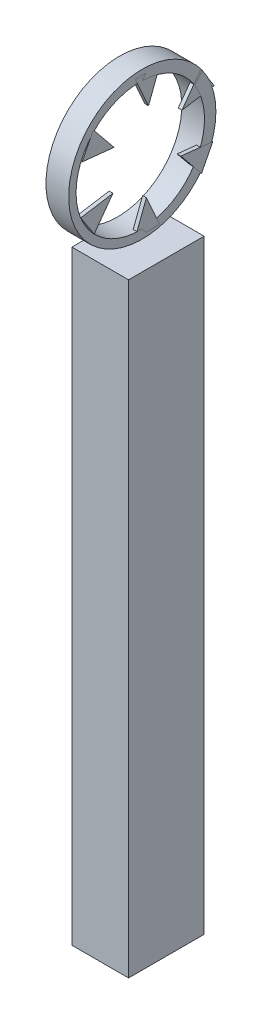
ISO-10303-21;
HEADER;
FILE_DESCRIPTION(('STEP AP214'),'2;1');
FILE_NAME('part.step','',(''),(''),'','','');
FILE_SCHEMA(('AUTOMOTIVE_DESIGN { 1 0 10303 214 1 1 1 1 }'));
ENDSEC;
DATA;
#1=APPLICATION_CONTEXT('core data for automotive mechanical design processes');
#2=APPLICATION_PROTOCOL_DEFINITION('international standard','automotive_design',2000,#1);
#3=PRODUCT_CONTEXT('',#1,'mechanical');
#4=PRODUCT('Part','Part','',(#3));
#5=PRODUCT_RELATED_PRODUCT_CATEGORY('part','',(#4));
#6=PRODUCT_DEFINITION_FORMATION('','',#4);
#7=PRODUCT_DEFINITION_CONTEXT('part definition',#1,'design');
#8=PRODUCT_DEFINITION('design','',#6,#7);
#9=PRODUCT_DEFINITION_SHAPE('','',#8);
#10=(LENGTH_UNIT() NAMED_UNIT(*) SI_UNIT(.MILLI.,.METRE.));
#11=(NAMED_UNIT(*) PLANE_ANGLE_UNIT() SI_UNIT($,.RADIAN.));
#12=(NAMED_UNIT(*) SI_UNIT($,.STERADIAN.) SOLID_ANGLE_UNIT());
#13=UNCERTAINTY_MEASURE_WITH_UNIT(LENGTH_MEASURE(1.E-05),#10,'distance_accuracy_value','');
#14=(GEOMETRIC_REPRESENTATION_CONTEXT(3) GLOBAL_UNCERTAINTY_ASSIGNED_CONTEXT((#13)) GLOBAL_UNIT_ASSIGNED_CONTEXT((#10,
#11,#12)) REPRESENTATION_CONTEXT('',''));
#15=CARTESIAN_POINT('',(0.,0.,0.));
#16=DIRECTION('',(0.,0.,1.));
#17=DIRECTION('',(1.,0.,0.));
#18=AXIS2_PLACEMENT_3D('',#15,#16,#17);
#19=CARTESIAN_POINT('',(8.255,32.5734694166654,31.4889569660101));
#20=DIRECTION('',(0.,-0.45432050294911,-0.890838302162669));
#21=DIRECTION('',(0.,0.89083830216267,-0.45432050294911));
#22=AXIS2_PLACEMENT_3D('',#19,#20,#21);
#23=PLANE('',#22);
#24=DIRECTION('',(0.,0.890838302162669,-0.45432050294911));
#25=VECTOR('',#24,1.);
#26=CARTESIAN_POINT('',(9.525,32.5734694166654,31.4889569660101));
#27=LINE('',#26,#25);
#28=CARTESIAN_POINT('',(9.525,32.5734694166654,31.4889569660101));
#29=VERTEX_POINT('',#28);
#30=CARTESIAN_POINT('',(9.525,39.9979876900178,27.7025112463823));
#31=VERTEX_POINT('',#30);
#32=EDGE_CURVE('E91',#29,#31,#27,.T.);
#33=ORIENTED_EDGE('',*,*,#32,.T.);
#34=DIRECTION('',(1.,0.,0.));
#35=VECTOR('',#34,1.);
#36=CARTESIAN_POINT('',(8.255,39.9979876900178,27.7025112463823));
#37=LINE('',#36,#35);
#38=CARTESIAN_POINT('',(8.255,39.9979876900178,27.7025112463823));
#39=VERTEX_POINT('',#38);
#40=EDGE_CURVE('E12',#39,#31,#37,.T.);
#41=ORIENTED_EDGE('',*,*,#40,.F.);
#42=DIRECTION('',(0.,0.890838302162669,-0.45432050294911));
#43=VECTOR('',#42,1.);
#44=CARTESIAN_POINT('',(8.255,32.5734694166654,31.4889569660101));
#45=LINE('',#44,#43);
#46=CARTESIAN_POINT('',(8.255,32.5734694166654,31.4889569660101));
#47=VERTEX_POINT('',#46);
#48=EDGE_CURVE('E84',#47,#39,#45,.T.);
#49=ORIENTED_EDGE('',*,*,#48,.F.);
#50=DIRECTION('',(1.,0.,0.));
#51=VECTOR('',#50,1.);
#52=CARTESIAN_POINT('',(8.255,32.5734694166654,31.4889569660101));
#53=LINE('',#52,#51);
#54=EDGE_CURVE('E92',#47,#29,#53,.T.);
#55=ORIENTED_EDGE('',*,*,#54,.T.);
#56=EDGE_LOOP('',(#33,#41,#49,#55));
#57=FACE_BOUND('',#56,.T.);
#58=ADVANCED_FACE('F44',(#57),#23,.F.);
#59=CARTESIAN_POINT('',(8.255,39.9979876900178,27.7025112463823));
#60=DIRECTION('',(0.,-0.630926660973929,0.775842476584189));
#61=DIRECTION('',(0.,-0.775842476584189,-0.630926660973929));
#62=AXIS2_PLACEMENT_3D('',#59,#60,#61);
#63=PLANE('',#62);
#64=DIRECTION('',(0.,-0.775842476584189,-0.630926660973929));
#65=VECTOR('',#64,1.);
#66=CARTESIAN_POINT('',(9.525,39.9979876900178,27.7025112463823));
#67=LINE('',#66,#65);
#68=CARTESIAN_POINT('',(9.525,31.4689193386133,20.7665457913043));
#69=VERTEX_POINT('',#68);
#70=EDGE_CURVE('E72',#31,#69,#67,.T.);
#71=ORIENTED_EDGE('',*,*,#70,.T.);
#72=DIRECTION('',(1.,0.,0.));
#73=VECTOR('',#72,1.);
#74=CARTESIAN_POINT('',(8.255,31.4689193386133,20.7665457913043));
#75=LINE('',#74,#73);
#76=CARTESIAN_POINT('',(8.255,31.4689193386133,20.7665457913043));
#77=VERTEX_POINT('',#76);
#78=EDGE_CURVE('E52',#77,#69,#75,.T.);
#79=ORIENTED_EDGE('',*,*,#78,.F.);
#80=DIRECTION('',(0.,-0.775842476584189,-0.630926660973929));
#81=VECTOR('',#80,1.);
#82=CARTESIAN_POINT('',(8.255,39.9979876900178,27.7025112463823));
#83=LINE('',#82,#81);
#84=EDGE_CURVE('E80',#39,#77,#83,.T.);
#85=ORIENTED_EDGE('',*,*,#84,.F.);
#86=ORIENTED_EDGE('',*,*,#40,.T.);
#87=EDGE_LOOP('',(#71,#79,#85,#86));
#88=FACE_BOUND('',#87,.T.);
#89=ADVANCED_FACE('F81',(#88),#63,.F.);
#90=CARTESIAN_POINT('',(8.255,31.4689193386133,20.7665457913043));
#91=DIRECTION('',(0.,0.994735996731296,-0.102470955919199));
#92=DIRECTION('',(0.,0.102470955919199,0.994735996731296));
#93=AXIS2_PLACEMENT_3D('',#90,#91,#92);
#94=PLANE('',#93);
#95=DIRECTION('',(0.,0.102470955919199,0.994735996731296));
#96=VECTOR('',#95,1.);
#97=CARTESIAN_POINT('',(9.525,31.4689193386133,20.7665457913043));
#98=LINE('',#97,#96);
#99=EDGE_CURVE('E77',#69,#29,#98,.T.);
#100=ORIENTED_EDGE('',*,*,#99,.T.);
#101=ORIENTED_EDGE('',*,*,#54,.F.);
#102=DIRECTION('',(0.,0.102470955919199,0.994735996731296));
#103=VECTOR('',#102,1.);
#104=CARTESIAN_POINT('',(8.255,31.4689193386133,20.7665457913043));
#105=LINE('',#104,#103);
#106=EDGE_CURVE('E60',#77,#47,#105,.T.);
#107=ORIENTED_EDGE('',*,*,#106,.F.);
#108=ORIENTED_EDGE('',*,*,#78,.T.);
#109=EDGE_LOOP('',(#100,#101,#107,#108));
#110=FACE_BOUND('',#109,.T.);
#111=ADVANCED_FACE('F99',(#110),#94,.F.);
#112=CARTESIAN_POINT('',(8.255,0.,0.));
#113=DIRECTION('',(1.,0.,0.));
#114=DIRECTION('',(0.,0.,-1.));
#115=AXIS2_PLACEMENT_3D('',#112,#113,#114);
#116=PLANE('',#115);
#117=ORIENTED_EDGE('',*,*,#48,.T.);
#118=ORIENTED_EDGE('',*,*,#84,.T.);
#119=ORIENTED_EDGE('',*,*,#106,.T.);
#120=EDGE_LOOP('',(#117,#118,#119));
#121=FACE_BOUND('',#120,.T.);
#122=ADVANCED_FACE('F87',(#121),#116,.F.);
#123=CARTESIAN_POINT('',(9.525,0.,0.));
#124=DIRECTION('',(1.,0.,0.));
#125=DIRECTION('',(0.,0.,-1.));
#126=AXIS2_PLACEMENT_3D('',#123,#124,#125);
#127=PLANE('',#126);
#128=ORIENTED_EDGE('',*,*,#32,.F.);
#129=ORIENTED_EDGE('',*,*,#99,.F.);
#130=ORIENTED_EDGE('',*,*,#70,.F.);
#131=EDGE_LOOP('',(#128,#129,#130));
#132=FACE_BOUND('',#131,.T.);
#133=ADVANCED_FACE('F100',(#132),#127,.T.);
#134=CLOSED_SHELL('',(#58,#89,#111,#122,#133));
#135=MANIFOLD_SOLID_BREP('B2',#134);
#136=CARTESIAN_POINT('',(8.255,47.5939942288502,13.5773551650429));
#137=DIRECTION('',(0.,-0.998648851811625,-0.0519660540672804));
#138=DIRECTION('',(0.,0.0519660540672804,-0.998648851811625));
#139=AXIS2_PLACEMENT_3D('',#136,#137,#138);
#140=PLANE('',#139);
#141=DIRECTION('',(0.,0.0519660540672804,-0.998648851811625));
#142=VECTOR('',#141,1.);
#143=CARTESIAN_POINT('',(9.525,47.5939942288502,13.5773551650429));
#144=LINE('',#143,#142);
#145=CARTESIAN_POINT('',(9.525,47.5939942288502,13.5773551650429));
#146=VERTEX_POINT('',#145);
#147=CARTESIAN_POINT('',(9.525,48.0270951822779,5.25431086964403));
#148=VERTEX_POINT('',#147);
#149=EDGE_CURVE('E199',#146,#148,#144,.T.);
#150=ORIENTED_EDGE('',*,*,#149,.T.);
#151=DIRECTION('',(1.,0.,0.));
#152=VECTOR('',#151,1.);
#153=CARTESIAN_POINT('',(8.255,48.0270951822779,5.25431086964403));
#154=LINE('',#153,#152);
#155=CARTESIAN_POINT('',(8.255,48.0270951822779,5.25431086964403));
#156=VERTEX_POINT('',#155);
#157=EDGE_CURVE('E42',#156,#148,#154,.T.);
#158=ORIENTED_EDGE('',*,*,#157,.F.);
#159=DIRECTION('',(0.,0.0519660540672804,-0.998648851811625));
#160=VECTOR('',#159,1.);
#161=CARTESIAN_POINT('',(8.255,47.5939942288502,13.5773551650429));
#162=LINE('',#161,#160);
#163=CARTESIAN_POINT('',(8.255,47.5939942288502,13.5773551650429));
#164=VERTEX_POINT('',#163);
#165=EDGE_CURVE('E192',#164,#156,#162,.T.);
#166=ORIENTED_EDGE('',*,*,#165,.F.);
#167=DIRECTION('',(1.,0.,0.));
#168=VECTOR('',#167,1.);
#169=CARTESIAN_POINT('',(8.255,47.5939942288502,13.5773551650429));
#170=LINE('',#169,#168);
#171=EDGE_CURVE('E200',#164,#146,#170,.T.);
#172=ORIENTED_EDGE('',*,*,#171,.T.);
#173=EDGE_LOOP('',(#150,#158,#166,#172));
#174=FACE_BOUND('',#173,.T.);
#175=ADVANCED_FACE('F152',(#174),#140,.F.);
#176=CARTESIAN_POINT('',(8.255,48.0270951822779,5.25431086964403));
#177=DIRECTION('',(0.,0.356435963569979,0.934319754620409));
#178=DIRECTION('',(0.,-0.934319754620409,0.356435963569979));
#179=AXIS2_PLACEMENT_3D('',#176,#177,#178);
#180=PLANE('',#179);
#181=DIRECTION('',(0.,-0.934319754620409,0.356435963569979));
#182=VECTOR('',#181,1.);
#183=CARTESIAN_POINT('',(9.525,48.0270951822779,5.25431086964403));
#184=LINE('',#183,#182);
#185=CARTESIAN_POINT('',(9.525,37.7558387227068,9.17271800503527));
#186=VERTEX_POINT('',#185);
#187=EDGE_CURVE('E180',#148,#186,#184,.T.);
#188=ORIENTED_EDGE('',*,*,#187,.T.);
#189=DIRECTION('',(1.,0.,0.));
#190=VECTOR('',#189,1.);
#191=CARTESIAN_POINT('',(8.255,37.7558387227068,9.17271800503527));
#192=LINE('',#191,#190);
#193=CARTESIAN_POINT('',(8.255,37.7558387227068,9.17271800503527));
#194=VERTEX_POINT('',#193);
#195=EDGE_CURVE('E160',#194,#186,#192,.T.);
#196=ORIENTED_EDGE('',*,*,#195,.F.);
#197=DIRECTION('',(0.,-0.934319754620409,0.356435963569979));
#198=VECTOR('',#197,1.);
#199=CARTESIAN_POINT('',(8.255,48.0270951822779,5.25431086964403));
#200=LINE('',#199,#198);
#201=EDGE_CURVE('E188',#156,#194,#200,.T.);
#202=ORIENTED_EDGE('',*,*,#201,.F.);
#203=ORIENTED_EDGE('',*,*,#157,.T.);
#204=EDGE_LOOP('',(#188,#196,#202,#203));
#205=FACE_BOUND('',#204,.T.);
#206=ADVANCED_FACE('F189',(#205),#180,.F.);
#207=CARTESIAN_POINT('',(8.255,37.7558387227068,9.17271800503527));
#208=DIRECTION('',(0.,0.408625547389544,-0.912702121187737));
#209=DIRECTION('',(0.,0.912702121187737,0.408625547389544));
#210=AXIS2_PLACEMENT_3D('',#207,#208,#209);
#211=PLANE('',#210);
#212=DIRECTION('',(0.,0.912702121187737,0.408625547389544));
#213=VECTOR('',#212,1.);
#214=CARTESIAN_POINT('',(9.525,37.7558387227068,9.17271800503527));
#215=LINE('',#214,#213);
#216=EDGE_CURVE('E185',#186,#146,#215,.T.);
#217=ORIENTED_EDGE('',*,*,#216,.T.);
#218=ORIENTED_EDGE('',*,*,#171,.F.);
#219=DIRECTION('',(0.,0.912702121187737,0.408625547389544));
#220=VECTOR('',#219,1.);
#221=CARTESIAN_POINT('',(8.255,37.7558387227068,9.17271800503527));
#222=LINE('',#221,#220);
#223=EDGE_CURVE('E168',#194,#164,#222,.T.);
#224=ORIENTED_EDGE('',*,*,#223,.F.);
#225=ORIENTED_EDGE('',*,*,#195,.T.);
#226=EDGE_LOOP('',(#217,#218,#224,#225));
#227=FACE_BOUND('',#226,.T.);
#228=ADVANCED_FACE('F207',(#227),#211,.F.);
#229=CARTESIAN_POINT('',(8.255,0.,0.));
#230=DIRECTION('',(1.,0.,0.));
#231=DIRECTION('',(0.,0.,-1.));
#232=AXIS2_PLACEMENT_3D('',#229,#230,#231);
#233=PLANE('',#232);
#234=ORIENTED_EDGE('',*,*,#165,.T.);
#235=ORIENTED_EDGE('',*,*,#201,.T.);
#236=ORIENTED_EDGE('',*,*,#223,.T.);
#237=EDGE_LOOP('',(#234,#235,#236));
#238=FACE_BOUND('',#237,.T.);
#239=ADVANCED_FACE('F195',(#238),#233,.F.);
#240=CARTESIAN_POINT('',(9.525,0.,0.));
#241=DIRECTION('',(1.,0.,0.));
#242=DIRECTION('',(0.,0.,-1.));
#243=AXIS2_PLACEMENT_3D('',#240,#241,#242);
#244=PLANE('',#243);
#245=ORIENTED_EDGE('',*,*,#149,.F.);
#246=ORIENTED_EDGE('',*,*,#216,.F.);
#247=ORIENTED_EDGE('',*,*,#187,.F.);
#248=EDGE_LOOP('',(#245,#246,#247));
#249=FACE_BOUND('',#248,.T.);
#250=ADVANCED_FACE('F208',(#249),#244,.T.);
#251=CLOSED_SHELL('',(#175,#206,#228,#239,#250));
#252=MANIFOLD_SOLID_BREP('B6',#251);
#253=CARTESIAN_POINT('',(8.255,39.592354452834,-8.38660180096717));
#254=DIRECTION('',(0.,-0.54432834886251,0.83887224809539));
#255=DIRECTION('',(0.,-0.83887224809539,-0.544328348862511));
#256=AXIS2_PLACEMENT_3D('',#253,#254,#255);
#257=PLANE('',#256);
#258=DIRECTION('',(0.,-0.83887224809539,-0.544328348862511));
#259=VECTOR('',#258,1.);
#260=CARTESIAN_POINT('',(9.525,39.592354452834,-8.38660180096717));
#261=LINE('',#260,#259);
#262=CARTESIAN_POINT('',(9.525,39.592354452834,-8.38660180096717));
#263=VERTEX_POINT('',#262);
#264=CARTESIAN_POINT('',(9.525,32.6009371329092,-12.9232003767382));
#265=VERTEX_POINT('',#264);
#266=EDGE_CURVE('E307',#263,#265,#261,.T.);
#267=ORIENTED_EDGE('',*,*,#266,.T.);
#268=DIRECTION('',(1.,0.,0.));
#269=VECTOR('',#268,1.);
#270=CARTESIAN_POINT('',(8.255,32.6009371329092,-12.9232003767382));
#271=LINE('',#270,#269);
#272=CARTESIAN_POINT('',(8.255,32.6009371329092,-12.9232003767382));
#273=VERTEX_POINT('',#272);
#274=EDGE_CURVE('E150',#273,#265,#271,.T.);
#275=ORIENTED_EDGE('',*,*,#274,.F.);
#276=DIRECTION('',(0.,-0.83887224809539,-0.544328348862511));
#277=VECTOR('',#276,1.);
#278=CARTESIAN_POINT('',(8.255,39.592354452834,-8.38660180096717));
#279=LINE('',#278,#277);
#280=CARTESIAN_POINT('',(8.255,39.592354452834,-8.38660180096717));
#281=VERTEX_POINT('',#280);
#282=EDGE_CURVE('E300',#281,#273,#279,.T.);
#283=ORIENTED_EDGE('',*,*,#282,.F.);
#284=DIRECTION('',(1.,0.,0.));
#285=VECTOR('',#284,1.);
#286=CARTESIAN_POINT('',(8.255,39.592354452834,-8.38660180096717));
#287=LINE('',#286,#285);
#288=EDGE_CURVE('E308',#281,#263,#287,.T.);
#289=ORIENTED_EDGE('',*,*,#288,.T.);
#290=EDGE_LOOP('',(#267,#275,#283,#289));
#291=FACE_BOUND('',#290,.T.);
#292=ADVANCED_FACE('F260',(#291),#257,.F.);
#293=CARTESIAN_POINT('',(8.255,32.6009371329092,-12.9232003767382));
#294=DIRECTION('',(0.,0.987362624543907,0.158477278036215));
#295=DIRECTION('',(0.,-0.158477278036215,0.987362624543907));
#296=AXIS2_PLACEMENT_3D('',#293,#294,#295);
#297=PLANE('',#296);
#298=DIRECTION('',(0.,-0.158477278036215,0.987362624543907));
#299=VECTOR('',#298,1.);
#300=CARTESIAN_POINT('',(9.525,32.6009371329092,-12.9232003767382));
#301=LINE('',#300,#299);
#302=CARTESIAN_POINT('',(9.525,30.8587490247427,-2.06882778626901));
#303=VERTEX_POINT('',#302);
#304=EDGE_CURVE('E288',#265,#303,#301,.T.);
#305=ORIENTED_EDGE('',*,*,#304,.T.);
#306=DIRECTION('',(1.,0.,0.));
#307=VECTOR('',#306,1.);
#308=CARTESIAN_POINT('',(8.255,30.8587490247427,-2.06882778626901));
#309=LINE('',#308,#307);
#310=CARTESIAN_POINT('',(8.255,30.8587490247427,-2.06882778626901));
#311=VERTEX_POINT('',#310);
#312=EDGE_CURVE('E268',#311,#303,#309,.T.);
#313=ORIENTED_EDGE('',*,*,#312,.F.);
#314=DIRECTION('',(0.,-0.158477278036215,0.987362624543907));
#315=VECTOR('',#314,1.);
#316=CARTESIAN_POINT('',(8.255,32.6009371329092,-12.9232003767382));
#317=LINE('',#316,#315);
#318=EDGE_CURVE('E296',#273,#311,#317,.T.);
#319=ORIENTED_EDGE('',*,*,#318,.F.);
#320=ORIENTED_EDGE('',*,*,#274,.T.);
#321=EDGE_LOOP('',(#305,#313,#319,#320));
#322=FACE_BOUND('',#321,.T.);
#323=ADVANCED_FACE('F297',(#322),#297,.F.);
#324=CARTESIAN_POINT('',(8.255,30.8587490247427,-2.06882778626901));
#325=DIRECTION('',(0.,-0.586110449341754,-0.810231165268535));
#326=DIRECTION('',(0.,0.810231165268535,-0.586110449341754));
#327=AXIS2_PLACEMENT_3D('',#324,#325,#326);
#328=PLANE('',#327);
#329=DIRECTION('',(0.,0.810231165268535,-0.586110449341754));
#330=VECTOR('',#329,1.);
#331=CARTESIAN_POINT('',(9.525,30.8587490247427,-2.06882778626901));
#332=LINE('',#331,#330);
#333=EDGE_CURVE('E293',#303,#263,#332,.T.);
#334=ORIENTED_EDGE('',*,*,#333,.T.);
#335=ORIENTED_EDGE('',*,*,#288,.F.);
#336=DIRECTION('',(0.,0.810231165268535,-0.586110449341754));
#337=VECTOR('',#336,1.);
#338=CARTESIAN_POINT('',(8.255,30.8587490247427,-2.06882778626901));
#339=LINE('',#338,#337);
#340=EDGE_CURVE('E276',#311,#281,#339,.T.);
#341=ORIENTED_EDGE('',*,*,#340,.F.);
#342=ORIENTED_EDGE('',*,*,#312,.T.);
#343=EDGE_LOOP('',(#334,#335,#341,#342));
#344=FACE_BOUND('',#343,.T.);
#345=ADVANCED_FACE('F315',(#344),#328,.F.);
#346=CARTESIAN_POINT('',(8.255,0.,0.));
#347=DIRECTION('',(1.,0.,0.));
#348=DIRECTION('',(0.,0.,-1.));
#349=AXIS2_PLACEMENT_3D('',#346,#347,#348);
#350=PLANE('',#349);
#351=ORIENTED_EDGE('',*,*,#282,.T.);
#352=ORIENTED_EDGE('',*,*,#318,.T.);
#353=ORIENTED_EDGE('',*,*,#340,.T.);
#354=EDGE_LOOP('',(#351,#352,#353));
#355=FACE_BOUND('',#354,.T.);
#356=ADVANCED_FACE('F303',(#355),#350,.F.);
#357=CARTESIAN_POINT('',(9.525,0.,0.));
#358=DIRECTION('',(1.,0.,0.));
#359=DIRECTION('',(0.,0.,-1.));
#360=AXIS2_PLACEMENT_3D('',#357,#358,#359);
#361=PLANE('',#360);
#362=ORIENTED_EDGE('',*,*,#266,.F.);
#363=ORIENTED_EDGE('',*,*,#333,.F.);
#364=ORIENTED_EDGE('',*,*,#304,.F.);
#365=EDGE_LOOP('',(#362,#363,#364));
#366=FACE_BOUND('',#365,.T.);
#367=ADVANCED_FACE('F316',(#366),#361,.T.);
#368=CLOSED_SHELL('',(#292,#323,#345,#356,#367));
#369=MANIFOLD_SOLID_BREP('B36',#368);
#370=CARTESIAN_POINT('',(8.255,16.5701898646329,-12.4389569660101));
#371=DIRECTION('',(0.,0.454320502949117,0.890838302162666));
#372=DIRECTION('',(0.,-0.890838302162666,0.454320502949117));
#373=AXIS2_PLACEMENT_3D('',#370,#371,#372);
#374=PLANE('',#373);
#375=DIRECTION('',(0.,-0.890838302162666,0.454320502949117));
#376=VECTOR('',#375,1.);
#377=CARTESIAN_POINT('',(9.525,16.5701898646329,-12.4389569660101));
#378=LINE('',#377,#376);
#379=CARTESIAN_POINT('',(9.525,16.5701898646329,-12.4389569660101));
#380=VERTEX_POINT('',#379);
#381=CARTESIAN_POINT('',(9.525,9.14567159128047,-8.6525112463822));
#382=VERTEX_POINT('',#381);
#383=EDGE_CURVE('E415',#380,#382,#378,.T.);
#384=ORIENTED_EDGE('',*,*,#383,.T.);
#385=DIRECTION('',(1.,0.,0.));
#386=VECTOR('',#385,1.);
#387=CARTESIAN_POINT('',(8.255,9.14567159128047,-8.6525112463822));
#388=LINE('',#387,#386);
#389=CARTESIAN_POINT('',(8.255,9.14567159128047,-8.6525112463822));
#390=VERTEX_POINT('',#389);
#391=EDGE_CURVE('E258',#390,#382,#388,.T.);
#392=ORIENTED_EDGE('',*,*,#391,.F.);
#393=DIRECTION('',(0.,-0.890838302162666,0.454320502949117));
#394=VECTOR('',#393,1.);
#395=CARTESIAN_POINT('',(8.255,16.5701898646329,-12.4389569660101));
#396=LINE('',#395,#394);
#397=CARTESIAN_POINT('',(8.255,16.5701898646329,-12.4389569660101));
#398=VERTEX_POINT('',#397);
#399=EDGE_CURVE('E408',#398,#390,#396,.T.);
#400=ORIENTED_EDGE('',*,*,#399,.F.);
#401=DIRECTION('',(1.,0.,0.));
#402=VECTOR('',#401,1.);
#403=CARTESIAN_POINT('',(8.255,16.5701898646329,-12.4389569660101));
#404=LINE('',#403,#402);
#405=EDGE_CURVE('E416',#398,#380,#404,.T.);
#406=ORIENTED_EDGE('',*,*,#405,.T.);
#407=EDGE_LOOP('',(#384,#392,#400,#406));
#408=FACE_BOUND('',#407,.T.);
#409=ADVANCED_FACE('F368',(#408),#374,.F.);
#410=CARTESIAN_POINT('',(8.255,9.14567159128047,-8.6525112463822));
#411=DIRECTION('',(0.,0.630926660973924,-0.775842476584194));
#412=DIRECTION('',(0.,0.775842476584194,0.630926660973924));
#413=AXIS2_PLACEMENT_3D('',#410,#411,#412);
#414=PLANE('',#413);
#415=DIRECTION('',(0.,0.775842476584194,0.630926660973924));
#416=VECTOR('',#415,1.);
#417=CARTESIAN_POINT('',(9.525,9.14567159128047,-8.6525112463822));
#418=LINE('',#417,#416);
#419=CARTESIAN_POINT('',(9.525,17.6747399426851,-1.71654579130426));
#420=VERTEX_POINT('',#419);
#421=EDGE_CURVE('E396',#382,#420,#418,.T.);
#422=ORIENTED_EDGE('',*,*,#421,.T.);
#423=DIRECTION('',(1.,0.,0.));
#424=VECTOR('',#423,1.);
#425=CARTESIAN_POINT('',(8.255,17.6747399426851,-1.71654579130426));
#426=LINE('',#425,#424);
#427=CARTESIAN_POINT('',(8.255,17.6747399426851,-1.71654579130426));
#428=VERTEX_POINT('',#427);
#429=EDGE_CURVE('E376',#428,#420,#426,.T.);
#430=ORIENTED_EDGE('',*,*,#429,.F.);
#431=DIRECTION('',(0.,0.775842476584194,0.630926660973924));
#432=VECTOR('',#431,1.);
#433=CARTESIAN_POINT('',(8.255,9.14567159128047,-8.6525112463822));
#434=LINE('',#433,#432);
#435=EDGE_CURVE('E404',#390,#428,#434,.T.);
#436=ORIENTED_EDGE('',*,*,#435,.F.);
#437=ORIENTED_EDGE('',*,*,#391,.T.);
#438=EDGE_LOOP('',(#422,#430,#436,#437));
#439=FACE_BOUND('',#438,.T.);
#440=ADVANCED_FACE('F405',(#439),#414,.F.);
#441=CARTESIAN_POINT('',(8.255,17.6747399426851,-1.71654579130426));
#442=DIRECTION('',(0.,-0.994735996731296,0.102470955919206));
#443=DIRECTION('',(0.,-0.102470955919206,-0.994735996731296));
#444=AXIS2_PLACEMENT_3D('',#441,#442,#443);
#445=PLANE('',#444);
#446=DIRECTION('',(0.,-0.102470955919206,-0.994735996731296));
#447=VECTOR('',#446,1.);
#448=CARTESIAN_POINT('',(9.525,17.6747399426851,-1.71654579130426));
#449=LINE('',#448,#447);
#450=EDGE_CURVE('E401',#420,#380,#449,.T.);
#451=ORIENTED_EDGE('',*,*,#450,.T.);
#452=ORIENTED_EDGE('',*,*,#405,.F.);
#453=DIRECTION('',(0.,-0.102470955919206,-0.994735996731296));
#454=VECTOR('',#453,1.);
#455=CARTESIAN_POINT('',(8.255,17.6747399426851,-1.71654579130426));
#456=LINE('',#455,#454);
#457=EDGE_CURVE('E384',#428,#398,#456,.T.);
#458=ORIENTED_EDGE('',*,*,#457,.F.);
#459=ORIENTED_EDGE('',*,*,#429,.T.);
#460=EDGE_LOOP('',(#451,#452,#458,#459));
#461=FACE_BOUND('',#460,.T.);
#462=ADVANCED_FACE('F423',(#461),#445,.F.);
#463=CARTESIAN_POINT('',(8.255,0.,0.));
#464=DIRECTION('',(1.,0.,0.));
#465=DIRECTION('',(0.,0.,-1.));
#466=AXIS2_PLACEMENT_3D('',#463,#464,#465);
#467=PLANE('',#466);
#468=ORIENTED_EDGE('',*,*,#399,.T.);
#469=ORIENTED_EDGE('',*,*,#435,.T.);
#470=ORIENTED_EDGE('',*,*,#457,.T.);
#471=EDGE_LOOP('',(#468,#469,#470));
#472=FACE_BOUND('',#471,.T.);
#473=ADVANCED_FACE('F411',(#472),#467,.F.);
#474=CARTESIAN_POINT('',(9.525,0.,0.));
#475=DIRECTION('',(1.,0.,0.));
#476=DIRECTION('',(0.,0.,-1.));
#477=AXIS2_PLACEMENT_3D('',#474,#475,#476);
#478=PLANE('',#477);
#479=ORIENTED_EDGE('',*,*,#383,.F.);
#480=ORIENTED_EDGE('',*,*,#450,.F.);
#481=ORIENTED_EDGE('',*,*,#421,.F.);
#482=EDGE_LOOP('',(#479,#480,#481));
#483=FACE_BOUND('',#482,.T.);
#484=ADVANCED_FACE('F424',(#483),#478,.T.);
#485=CLOSED_SHELL('',(#409,#440,#462,#473,#484));
#486=MANIFOLD_SOLID_BREP('B144',#485);
#487=CARTESIAN_POINT('',(8.255,1.54966505244817,5.4726448349572));
#488=DIRECTION('',(0.,0.998648851811625,0.0519660540672724));
#489=DIRECTION('',(0.,-0.0519660540672724,0.998648851811625));
#490=AXIS2_PLACEMENT_3D('',#487,#488,#489);
#491=PLANE('',#490);
#492=DIRECTION('',(0.,-0.0519660540672724,0.998648851811625));
#493=VECTOR('',#492,1.);
#494=CARTESIAN_POINT('',(9.525,1.54966505244817,5.4726448349572));
#495=LINE('',#494,#493);
#496=CARTESIAN_POINT('',(9.525,1.54966505244817,5.4726448349572));
#497=VERTEX_POINT('',#496);
#498=CARTESIAN_POINT('',(9.525,1.11656409902056,13.7956891303561));
#499=VERTEX_POINT('',#498);
#500=EDGE_CURVE('E523',#497,#499,#495,.T.);
#501=ORIENTED_EDGE('',*,*,#500,.T.);
#502=DIRECTION('',(1.,0.,0.));
#503=VECTOR('',#502,1.);
#504=CARTESIAN_POINT('',(8.255,1.11656409902056,13.7956891303561));
#505=LINE('',#504,#503);
#506=CARTESIAN_POINT('',(8.255,1.11656409902056,13.7956891303561));
#507=VERTEX_POINT('',#506);
#508=EDGE_CURVE('E366',#507,#499,#505,.T.);
#509=ORIENTED_EDGE('',*,*,#508,.F.);
#510=DIRECTION('',(0.,-0.0519660540672724,0.998648851811625));
#511=VECTOR('',#510,1.);
#512=CARTESIAN_POINT('',(8.255,1.54966505244817,5.4726448349572));
#513=LINE('',#512,#511);
#514=CARTESIAN_POINT('',(8.255,1.54966505244817,5.4726448349572));
#515=VERTEX_POINT('',#514);
#516=EDGE_CURVE('E516',#515,#507,#513,.T.);
#517=ORIENTED_EDGE('',*,*,#516,.F.);
#518=DIRECTION('',(1.,0.,0.));
#519=VECTOR('',#518,1.);
#520=CARTESIAN_POINT('',(8.255,1.54966505244817,5.4726448349572));
#521=LINE('',#520,#519);
#522=EDGE_CURVE('E524',#515,#497,#521,.T.);
#523=ORIENTED_EDGE('',*,*,#522,.T.);
#524=EDGE_LOOP('',(#501,#509,#517,#523));
#525=FACE_BOUND('',#524,.T.);
#526=ADVANCED_FACE('F476',(#525),#491,.F.);
#527=CARTESIAN_POINT('',(8.255,1.11656409902056,13.7956891303561));
#528=DIRECTION('',(0.,-0.356435963569986,-0.934319754620406));
#529=DIRECTION('',(0.,0.934319754620406,-0.356435963569986));
#530=AXIS2_PLACEMENT_3D('',#527,#528,#529);
#531=PLANE('',#530);
#532=DIRECTION('',(0.,0.934319754620406,-0.356435963569985));
#533=VECTOR('',#532,1.);
#534=CARTESIAN_POINT('',(9.525,1.11656409902056,13.7956891303561));
#535=LINE('',#534,#533);
#536=CARTESIAN_POINT('',(9.525,11.3878205585916,9.87728199496479));
#537=VERTEX_POINT('',#536);
#538=EDGE_CURVE('E504',#499,#537,#535,.T.);
#539=ORIENTED_EDGE('',*,*,#538,.T.);
#540=DIRECTION('',(1.,0.,0.));
#541=VECTOR('',#540,1.);
#542=CARTESIAN_POINT('',(8.255,11.3878205585916,9.87728199496479));
#543=LINE('',#542,#541);
#544=CARTESIAN_POINT('',(8.255,11.3878205585916,9.87728199496479));
#545=VERTEX_POINT('',#544);
#546=EDGE_CURVE('E484',#545,#537,#543,.T.);
#547=ORIENTED_EDGE('',*,*,#546,.F.);
#548=DIRECTION('',(0.,0.934319754620406,-0.356435963569985));
#549=VECTOR('',#548,1.);
#550=CARTESIAN_POINT('',(8.255,1.11656409902056,13.7956891303561));
#551=LINE('',#550,#549);
#552=EDGE_CURVE('E512',#507,#545,#551,.T.);
#553=ORIENTED_EDGE('',*,*,#552,.F.);
#554=ORIENTED_EDGE('',*,*,#508,.T.);
#555=EDGE_LOOP('',(#539,#547,#553,#554));
#556=FACE_BOUND('',#555,.T.);
#557=ADVANCED_FACE('F513',(#556),#531,.F.);
#558=CARTESIAN_POINT('',(8.255,11.3878205585916,9.87728199496479));
#559=DIRECTION('',(0.,-0.408625547389538,0.91270212118774));
#560=DIRECTION('',(0.,-0.91270212118774,-0.408625547389538));
#561=AXIS2_PLACEMENT_3D('',#558,#559,#560);
#562=PLANE('',#561);
#563=DIRECTION('',(0.,-0.91270212118774,-0.408625547389538));
#564=VECTOR('',#563,1.);
#565=CARTESIAN_POINT('',(9.525,11.3878205585916,9.87728199496479));
#566=LINE('',#565,#564);
#567=EDGE_CURVE('E509',#537,#497,#566,.T.);
#568=ORIENTED_EDGE('',*,*,#567,.T.);
#569=ORIENTED_EDGE('',*,*,#522,.F.);
#570=DIRECTION('',(0.,-0.91270212118774,-0.408625547389538));
#571=VECTOR('',#570,1.);
#572=CARTESIAN_POINT('',(8.255,11.3878205585916,9.87728199496479));
#573=LINE('',#572,#571);
#574=EDGE_CURVE('E492',#545,#515,#573,.T.);
#575=ORIENTED_EDGE('',*,*,#574,.F.);
#576=ORIENTED_EDGE('',*,*,#546,.T.);
#577=EDGE_LOOP('',(#568,#569,#575,#576));
#578=FACE_BOUND('',#577,.T.);
#579=ADVANCED_FACE('F531',(#578),#562,.F.);
#580=CARTESIAN_POINT('',(8.255,0.,0.));
#581=DIRECTION('',(1.,0.,0.));
#582=DIRECTION('',(0.,0.,-1.));
#583=AXIS2_PLACEMENT_3D('',#580,#581,#582);
#584=PLANE('',#583);
#585=ORIENTED_EDGE('',*,*,#516,.T.);
#586=ORIENTED_EDGE('',*,*,#552,.T.);
#587=ORIENTED_EDGE('',*,*,#574,.T.);
#588=EDGE_LOOP('',(#585,#586,#587));
#589=FACE_BOUND('',#588,.T.);
#590=ADVANCED_FACE('F519',(#589),#584,.F.);
#591=CARTESIAN_POINT('',(9.525,0.,0.));
#592=DIRECTION('',(1.,0.,0.));
#593=DIRECTION('',(0.,0.,-1.));
#594=AXIS2_PLACEMENT_3D('',#591,#592,#593);
#595=PLANE('',#594);
#596=ORIENTED_EDGE('',*,*,#500,.F.);
#597=ORIENTED_EDGE('',*,*,#567,.F.);
#598=ORIENTED_EDGE('',*,*,#538,.F.);
#599=EDGE_LOOP('',(#596,#597,#598));
#600=FACE_BOUND('',#599,.T.);
#601=ADVANCED_FACE('F532',(#600),#595,.T.);
#602=CLOSED_SHELL('',(#526,#557,#579,#590,#601));
#603=MANIFOLD_SOLID_BREP('B252',#602);
#604=CARTESIAN_POINT('',(8.255,9.5513048284646,27.4366018009673));
#605=DIRECTION('',(0.,0.544328348862504,-0.838872248095394));
#606=DIRECTION('',(0.,0.838872248095394,0.544328348862504));
#607=AXIS2_PLACEMENT_3D('',#604,#605,#606);
#608=PLANE('',#607);
#609=DIRECTION('',(0.,0.838872248095394,0.544328348862505));
#610=VECTOR('',#609,1.);
#611=CARTESIAN_POINT('',(9.525,9.5513048284646,27.4366018009673));
#612=LINE('',#611,#610);
#613=CARTESIAN_POINT('',(9.525,9.5513048284646,27.4366018009673));
#614=VERTEX_POINT('',#613);
#615=CARTESIAN_POINT('',(9.525,16.5427221483894,31.9732003767383));
#616=VERTEX_POINT('',#615);
#617=EDGE_CURVE('E629',#614,#616,#612,.T.);
#618=ORIENTED_EDGE('',*,*,#617,.T.);
#619=DIRECTION('',(1.,0.,0.));
#620=VECTOR('',#619,1.);
#621=CARTESIAN_POINT('',(8.255,16.5427221483894,31.9732003767383));
#622=LINE('',#621,#620);
#623=CARTESIAN_POINT('',(8.255,16.5427221483894,31.9732003767383));
#624=VERTEX_POINT('',#623);
#625=EDGE_CURVE('E474',#624,#616,#622,.T.);
#626=ORIENTED_EDGE('',*,*,#625,.F.);
#627=DIRECTION('',(0.,0.838872248095394,0.544328348862505));
#628=VECTOR('',#627,1.);
#629=CARTESIAN_POINT('',(8.255,9.5513048284646,27.4366018009673));
#630=LINE('',#629,#628);
#631=CARTESIAN_POINT('',(8.255,9.5513048284646,27.4366018009673));
#632=VERTEX_POINT('',#631);
#633=EDGE_CURVE('E622',#632,#624,#630,.T.);
#634=ORIENTED_EDGE('',*,*,#633,.F.);
#635=DIRECTION('',(1.,0.,0.));
#636=VECTOR('',#635,1.);
#637=CARTESIAN_POINT('',(8.255,9.5513048284646,27.4366018009673));
#638=LINE('',#637,#636);
#639=EDGE_CURVE('E630',#632,#614,#638,.T.);
#640=ORIENTED_EDGE('',*,*,#639,.T.);
#641=EDGE_LOOP('',(#618,#626,#634,#640));
#642=FACE_BOUND('',#641,.T.);
#643=ADVANCED_FACE('F582',(#642),#608,.F.);
#644=CARTESIAN_POINT('',(8.255,16.5427221483894,31.9732003767383));
#645=DIRECTION('',(0.,-0.987362624543908,-0.158477278036209));
#646=DIRECTION('',(0.,0.158477278036209,-0.987362624543908));
#647=AXIS2_PLACEMENT_3D('',#644,#645,#646);
#648=PLANE('',#647);
#649=DIRECTION('',(0.,0.158477278036209,-0.987362624543908));
#650=VECTOR('',#649,1.);
#651=CARTESIAN_POINT('',(9.525,16.5427221483894,31.9732003767383));
#652=LINE('',#651,#650);
#653=CARTESIAN_POINT('',(9.525,18.2849102565558,21.118827786269));
#654=VERTEX_POINT('',#653);
#655=EDGE_CURVE('E610',#616,#654,#652,.T.);
#656=ORIENTED_EDGE('',*,*,#655,.T.);
#657=DIRECTION('',(1.,0.,0.));
#658=VECTOR('',#657,1.);
#659=CARTESIAN_POINT('',(8.255,18.2849102565558,21.118827786269));
#660=LINE('',#659,#658);
#661=CARTESIAN_POINT('',(8.255,18.2849102565558,21.118827786269));
#662=VERTEX_POINT('',#661);
#663=EDGE_CURVE('E590',#662,#654,#660,.T.);
#664=ORIENTED_EDGE('',*,*,#663,.F.);
#665=DIRECTION('',(0.,0.158477278036209,-0.987362624543908));
#666=VECTOR('',#665,1.);
#667=CARTESIAN_POINT('',(8.255,16.5427221483894,31.9732003767383));
#668=LINE('',#667,#666);
#669=EDGE_CURVE('E618',#624,#662,#668,.T.);
#670=ORIENTED_EDGE('',*,*,#669,.F.);
#671=ORIENTED_EDGE('',*,*,#625,.T.);
#672=EDGE_LOOP('',(#656,#664,#670,#671));
#673=FACE_BOUND('',#672,.T.);
#674=ADVANCED_FACE('F619',(#673),#648,.F.);
#675=CARTESIAN_POINT('',(8.255,18.2849102565558,21.118827786269));
#676=DIRECTION('',(0.,0.586110449341759,0.81023116526853));
#677=DIRECTION('',(0.,-0.810231165268531,0.586110449341759));
#678=AXIS2_PLACEMENT_3D('',#675,#676,#677);
#679=PLANE('',#678);
#680=DIRECTION('',(0.,-0.81023116526853,0.586110449341759));
#681=VECTOR('',#680,1.);
#682=CARTESIAN_POINT('',(9.525,18.2849102565558,21.118827786269));
#683=LINE('',#682,#681);
#684=EDGE_CURVE('E615',#654,#614,#683,.T.);
#685=ORIENTED_EDGE('',*,*,#684,.T.);
#686=ORIENTED_EDGE('',*,*,#639,.F.);
#687=DIRECTION('',(0.,-0.81023116526853,0.586110449341759));
#688=VECTOR('',#687,1.);
#689=CARTESIAN_POINT('',(8.255,18.2849102565558,21.118827786269));
#690=LINE('',#689,#688);
#691=EDGE_CURVE('E598',#662,#632,#690,.T.);
#692=ORIENTED_EDGE('',*,*,#691,.F.);
#693=ORIENTED_EDGE('',*,*,#663,.T.);
#694=EDGE_LOOP('',(#685,#686,#692,#693));
#695=FACE_BOUND('',#694,.T.);
#696=ADVANCED_FACE('F637',(#695),#679,.F.);
#697=CARTESIAN_POINT('',(8.255,0.,0.));
#698=DIRECTION('',(1.,0.,0.));
#699=DIRECTION('',(0.,0.,-1.));
#700=AXIS2_PLACEMENT_3D('',#697,#698,#699);
#701=PLANE('',#700);
#702=ORIENTED_EDGE('',*,*,#633,.T.);
#703=ORIENTED_EDGE('',*,*,#669,.T.);
#704=ORIENTED_EDGE('',*,*,#691,.T.);
#705=EDGE_LOOP('',(#702,#703,#704));
#706=FACE_BOUND('',#705,.T.);
#707=ADVANCED_FACE('F625',(#706),#701,.F.);
#708=CARTESIAN_POINT('',(9.525,0.,0.));
#709=DIRECTION('',(1.,0.,0.));
#710=DIRECTION('',(0.,0.,-1.));
#711=AXIS2_PLACEMENT_3D('',#708,#709,#710);
#712=PLANE('',#711);
#713=ORIENTED_EDGE('',*,*,#617,.F.);
#714=ORIENTED_EDGE('',*,*,#684,.F.);
#715=ORIENTED_EDGE('',*,*,#655,.F.);
#716=EDGE_LOOP('',(#713,#714,#715));
#717=FACE_BOUND('',#716,.T.);
#718=ADVANCED_FACE('F638',(#717),#712,.T.);
#719=CLOSED_SHELL('',(#643,#674,#696,#707,#718));
#720=MANIFOLD_SOLID_BREP('B360',#719);
#721=CARTESIAN_POINT('',(1.905,24.7433494676496,11.2667560121023));
#722=DIRECTION('',(1.,0.,0.));
#723=DIRECTION('',(0.,0.,-1.));
#724=AXIS2_PLACEMENT_3D('',#721,#722,#723);
#725=CYLINDRICAL_SURFACE('',#724,24.7433494676496);
#726=CARTESIAN_POINT('',(1.905,24.7433494676496,11.2667560121023));
#727=DIRECTION('',(-1.,0.,0.));
#728=DIRECTION('',(0.,0.,1.));
#729=AXIS2_PLACEMENT_3D('',#726,#727,#728);
#730=CIRCLE('',#729,24.7433494676496);
#731=CARTESIAN_POINT('',(1.905,24.7433494676496,-13.4765934555474));
#732=VERTEX_POINT('',#731);
#733=EDGE_CURVE('E581',#732,#732,#730,.T.);
#734=CARTESIAN_POINT('',(9.525,24.7433494676496,11.2667560121023));
#735=DIRECTION('',(-1.,0.,0.));
#736=DIRECTION('',(0.,0.,1.));
#737=AXIS2_PLACEMENT_3D('',#734,#735,#736);
#738=CIRCLE('',#737,24.7433494676496);
#739=CARTESIAN_POINT('',(9.525,24.7433494676496,-13.4765934555474));
#740=VERTEX_POINT('',#739);
#741=EDGE_CURVE('E696',#740,#740,#738,.T.);
#742=CARTESIAN_POINT('',(1.905,24.7433494676496,-13.4765934555474));
#743=CARTESIAN_POINT('',(1.984375,24.7433494676496,-13.4765934555474));
#744=CARTESIAN_POINT('',(2.06375,24.7433494676496,-13.4765934555474));
#745=CARTESIAN_POINT('',(2.2225,24.7433494676496,-13.4765934555474));
#746=CARTESIAN_POINT('',(2.301875,24.7433494676496,-13.4765934555474));
#747=CARTESIAN_POINT('',(2.460625,24.7433494676496,-13.4765934555474));
#748=CARTESIAN_POINT('',(2.54,24.7433494676496,-13.4765934555474));
#749=CARTESIAN_POINT('',(2.69875,24.7433494676496,-13.4765934555474));
#750=CARTESIAN_POINT('',(2.778125,24.7433494676496,-13.4765934555474));
#751=CARTESIAN_POINT('',(2.936875,24.7433494676496,-13.4765934555474));
#752=CARTESIAN_POINT('',(3.01625,24.7433494676496,-13.4765934555474));
#753=CARTESIAN_POINT('',(3.175,24.7433494676496,-13.4765934555474));
#754=CARTESIAN_POINT('',(3.254375,24.7433494676496,-13.4765934555474));
#755=CARTESIAN_POINT('',(3.413125,24.7433494676496,-13.4765934555474));
#756=CARTESIAN_POINT('',(3.4925,24.7433494676496,-13.4765934555474));
#757=CARTESIAN_POINT('',(3.65125,24.7433494676496,-13.4765934555474));
#758=CARTESIAN_POINT('',(3.730625,24.7433494676496,-13.4765934555474));
#759=CARTESIAN_POINT('',(3.889375,24.7433494676496,-13.4765934555474));
#760=CARTESIAN_POINT('',(3.96875,24.7433494676496,-13.4765934555474));
#761=CARTESIAN_POINT('',(4.1275,24.7433494676496,-13.4765934555474));
#762=CARTESIAN_POINT('',(4.206875,24.7433494676496,-13.4765934555474));
#763=CARTESIAN_POINT('',(4.365625,24.7433494676496,-13.4765934555474));
#764=CARTESIAN_POINT('',(4.445,24.7433494676496,-13.4765934555474));
#765=CARTESIAN_POINT('',(4.60375,24.7433494676496,-13.4765934555474));
#766=CARTESIAN_POINT('',(4.683125,24.7433494676496,-13.4765934555474));
#767=CARTESIAN_POINT('',(4.841875,24.7433494676496,-13.4765934555474));
#768=CARTESIAN_POINT('',(4.92125,24.7433494676496,-13.4765934555474));
#769=CARTESIAN_POINT('',(5.08,24.7433494676496,-13.4765934555474));
#770=CARTESIAN_POINT('',(5.159375,24.7433494676496,-13.4765934555474));
#771=CARTESIAN_POINT('',(5.318125,24.7433494676496,-13.4765934555474));
#772=CARTESIAN_POINT('',(5.3975,24.7433494676496,-13.4765934555474));
#773=CARTESIAN_POINT('',(5.55625,24.7433494676496,-13.4765934555474));
#774=CARTESIAN_POINT('',(5.635625,24.7433494676496,-13.4765934555474));
#775=CARTESIAN_POINT('',(5.794375,24.7433494676496,-13.4765934555474));
#776=CARTESIAN_POINT('',(5.87375,24.7433494676496,-13.4765934555474));
#777=CARTESIAN_POINT('',(6.0325,24.7433494676496,-13.4765934555474));
#778=CARTESIAN_POINT('',(6.111875,24.7433494676496,-13.4765934555474));
#779=CARTESIAN_POINT('',(6.270625,24.7433494676496,-13.4765934555474));
#780=CARTESIAN_POINT('',(6.35,24.7433494676496,-13.4765934555474));
#781=CARTESIAN_POINT('',(6.50875,24.7433494676496,-13.4765934555474));
#782=CARTESIAN_POINT('',(6.588125,24.7433494676496,-13.4765934555474));
#783=CARTESIAN_POINT('',(6.746875,24.7433494676496,-13.4765934555474));
#784=CARTESIAN_POINT('',(6.82625,24.7433494676496,-13.4765934555474));
#785=CARTESIAN_POINT('',(6.985,24.7433494676496,-13.4765934555474));
#786=CARTESIAN_POINT('',(7.064375,24.7433494676496,-13.4765934555474));
#787=CARTESIAN_POINT('',(7.223125,24.7433494676496,-13.4765934555474));
#788=CARTESIAN_POINT('',(7.3025,24.7433494676496,-13.4765934555474));
#789=CARTESIAN_POINT('',(7.46125,24.7433494676496,-13.4765934555474));
#790=CARTESIAN_POINT('',(7.540625,24.7433494676496,-13.4765934555474));
#791=CARTESIAN_POINT('',(7.699375,24.7433494676496,-13.4765934555474));
#792=CARTESIAN_POINT('',(7.77875,24.7433494676496,-13.4765934555474));
#793=CARTESIAN_POINT('',(7.9375,24.7433494676496,-13.4765934555474));
#794=CARTESIAN_POINT('',(8.016875,24.7433494676496,-13.4765934555474));
#795=CARTESIAN_POINT('',(8.175625,24.7433494676496,-13.4765934555474));
#796=CARTESIAN_POINT('',(8.255,24.7433494676496,-13.4765934555474));
#797=CARTESIAN_POINT('',(8.41375,24.7433494676496,-13.4765934555474));
#798=CARTESIAN_POINT('',(8.493125,24.7433494676496,-13.4765934555474));
#799=CARTESIAN_POINT('',(8.651875,24.7433494676496,-13.4765934555474));
#800=CARTESIAN_POINT('',(8.73125,24.7433494676496,-13.4765934555474));
#801=CARTESIAN_POINT('',(8.89,24.7433494676496,-13.4765934555474));
#802=CARTESIAN_POINT('',(8.969375,24.7433494676496,-13.4765934555474));
#803=CARTESIAN_POINT('',(9.128125,24.7433494676496,-13.4765934555474));
#804=CARTESIAN_POINT('',(9.2075,24.7433494676496,-13.4765934555474));
#805=CARTESIAN_POINT('',(9.36625,24.7433494676496,-13.4765934555474));
#806=CARTESIAN_POINT('',(9.445625,24.7433494676496,-13.4765934555474));
#807=CARTESIAN_POINT('',(9.525,24.7433494676496,-13.4765934555474));
#808=B_SPLINE_CURVE_WITH_KNOTS('',3,(#742,#743,#744,#745,#746,#747,#748,#749,#750,#751,#752,
#753,#754,#755,#756,#757,#758,#759,#760,#761,#762,#763,#764,#765,#766,#767,#768,#769,#770,#771,
#772,#773,#774,#775,#776,#777,#778,#779,#780,#781,#782,#783,#784,#785,#786,#787,#788,#789,#790,
#791,#792,#793,#794,#795,#796,#797,#798,#799,#800,#801,#802,#803,#804,#805,#806,#807),
.UNSPECIFIED.,.F.,.F.,(4,2,2,2,2,2,2,2,2,2,2,2,2,2,2,2,2,2,2,2,2,2,2,2,2,2,2,2,2,2,2,2,4),(0.,
0.238125,0.47625,0.714375,0.9525,1.190625,1.42875,1.666875,1.905,2.143125,2.38125,2.619375,
2.8575,3.095625,3.33375,3.571875,3.81,4.048125,4.28625,4.524375,4.7625,5.000625,5.23875,
5.476875,5.715,5.953125,6.19125,6.429375,6.6675,6.905625,7.14375,7.381875,7.62),.UNSPECIFIED.);
#809=EDGE_CURVE('BSEAM689',#732,#740,#808,.T.);
#810=ORIENTED_EDGE('',*,*,#733,.F.);
#811=ORIENTED_EDGE('',*,*,#741,.T.);
#812=ORIENTED_EDGE('',*,*,#809,.T.);
#813=ORIENTED_EDGE('',*,*,#809,.F.);
#814=EDGE_LOOP('',(#810,#812,#811,#813));
#815=FACE_BOUND('',#814,.T.);
#816=ADVANCED_FACE('F689',(#815),#725,.T.);
#817=CARTESIAN_POINT('',(1.905,24.7433494676496,11.2667560121023));
#818=DIRECTION('',(-1.,0.,0.));
#819=DIRECTION('',(0.,0.,1.));
#820=AXIS2_PLACEMENT_3D('',#817,#818,#819);
#821=PLANE('',#820);
#822=CARTESIAN_POINT('',(1.905,24.5718296406492,11.9438411427671));
#823=DIRECTION('',(-1.,0.,0.));
#824=DIRECTION('',(0.,0.,1.));
#825=AXIS2_PLACEMENT_3D('',#822,#823,#824);
#826=CIRCLE('',#825,21.5787348666628);
#827=CARTESIAN_POINT('',(1.905,24.5718296406492,33.5225760094299));
#828=VERTEX_POINT('',#827);
#829=EDGE_CURVE('E702',#828,#828,#826,.T.);
#830=ORIENTED_EDGE('',*,*,#829,.F.);
#831=EDGE_LOOP('',(#830));
#832=FACE_BOUND('',#831,.T.);
#833=ORIENTED_EDGE('',*,*,#733,.T.);
#834=EDGE_LOOP('',(#833));
#835=FACE_BOUND('',#834,.T.);
#836=ADVANCED_FACE('F718',(#832,#835),#821,.T.);
#837=CARTESIAN_POINT('',(9.525,24.7433494676496,11.2667560121023));
#838=DIRECTION('',(-1.,0.,0.));
#839=DIRECTION('',(0.,0.,1.));
#840=AXIS2_PLACEMENT_3D('',#837,#838,#839);
#841=PLANE('',#840);
#842=CARTESIAN_POINT('',(9.525,24.5718296406492,11.9438411427671));
#843=DIRECTION('',(-1.,0.,0.));
#844=DIRECTION('',(0.,0.,1.));
#845=AXIS2_PLACEMENT_3D('',#842,#843,#844);
#846=CIRCLE('',#845,21.5787348666628);
#847=CARTESIAN_POINT('',(9.525,24.5718296406492,33.5225760094299));
#848=VERTEX_POINT('',#847);
#849=EDGE_CURVE('E692',#848,#848,#846,.T.);
#850=ORIENTED_EDGE('',*,*,#849,.T.);
#851=EDGE_LOOP('',(#850));
#852=FACE_BOUND('',#851,.T.);
#853=ORIENTED_EDGE('',*,*,#741,.F.);
#854=EDGE_LOOP('',(#853));
#855=FACE_BOUND('',#854,.T.);
#856=ADVANCED_FACE('F709',(#852,#855),#841,.F.);
#857=CARTESIAN_POINT('',(27.305,24.5718296406492,11.9438411427671));
#858=DIRECTION('',(-1.,0.,0.));
#859=DIRECTION('',(0.,0.,1.));
#860=AXIS2_PLACEMENT_3D('',#857,#858,#859);
#861=CYLINDRICAL_SURFACE('',#860,21.5787348666628);
#862=ORIENTED_EDGE('',*,*,#829,.T.);
#863=EDGE_LOOP('',(#862));
#864=FACE_BOUND('',#863,.T.);
#865=ORIENTED_EDGE('',*,*,#849,.F.);
#866=EDGE_LOOP('',(#865));
#867=FACE_BOUND('',#866,.T.);
#868=ADVANCED_FACE('F712',(#864,#867),#861,.F.);
#869=CLOSED_SHELL('',(#816,#836,#856,#868));
#870=MANIFOLD_SOLID_BREP('B468',#869);
#871=CARTESIAN_POINT('',(0.,0.,25.4));
#872=DIRECTION('',(1.,0.,0.));
#873=DIRECTION('',(0.,1.,0.));
#874=AXIS2_PLACEMENT_3D('',#871,#872,#873);
#875=PLANE('',#874);
#876=DIRECTION('',(0.,-1.,0.));
#877=VECTOR('',#876,1.);
#878=CARTESIAN_POINT('',(0.,0.,0.));
#879=LINE('',#878,#877);
#880=CARTESIAN_POINT('',(0.,0.,0.));
#881=VERTEX_POINT('',#880);
#882=CARTESIAN_POINT('',(0.,-203.2,0.));
#883=VERTEX_POINT('',#882);
#884=EDGE_CURVE('E814',#881,#883,#879,.T.);
#885=ORIENTED_EDGE('',*,*,#884,.T.);
#886=DIRECTION('',(0.,0.,-1.));
#887=VECTOR('',#886,1.);
#888=CARTESIAN_POINT('',(0.,-203.2,25.4));
#889=LINE('',#888,#887);
#890=CARTESIAN_POINT('',(0.,-203.2,25.4));
#891=VERTEX_POINT('',#890);
#892=EDGE_CURVE('E687',#891,#883,#889,.T.);
#893=ORIENTED_EDGE('',*,*,#892,.F.);
#894=DIRECTION('',(0.,-1.,0.));
#895=VECTOR('',#894,1.);
#896=CARTESIAN_POINT('',(0.,0.,25.4));
#897=LINE('',#896,#895);
#898=CARTESIAN_POINT('',(0.,0.,25.4));
#899=VERTEX_POINT('',#898);
#900=EDGE_CURVE('E802',#899,#891,#897,.T.);
#901=ORIENTED_EDGE('',*,*,#900,.F.);
#902=DIRECTION('',(0.,0.,-1.));
#903=VECTOR('',#902,1.);
#904=CARTESIAN_POINT('',(0.,0.,25.4));
#905=LINE('',#904,#903);
#906=EDGE_CURVE('E810',#899,#881,#905,.T.);
#907=ORIENTED_EDGE('',*,*,#906,.T.);
#908=EDGE_LOOP('',(#885,#893,#901,#907));
#909=FACE_BOUND('',#908,.T.);
#910=ADVANCED_FACE('F751',(#909),#875,.F.);
#911=CARTESIAN_POINT('',(0.,-203.2,25.4));
#912=DIRECTION('',(0.,1.,0.));
#913=DIRECTION('',(0.,0.,1.));
#914=AXIS2_PLACEMENT_3D('',#911,#912,#913);
#915=PLANE('',#914);
#916=DIRECTION('',(1.,0.,0.));
#917=VECTOR('',#916,1.);
#918=CARTESIAN_POINT('',(0.,-203.2,0.));
#919=LINE('',#918,#917);
#920=CARTESIAN_POINT('',(19.05,-203.2,0.));
#921=VERTEX_POINT('',#920);
#922=EDGE_CURVE('E806',#883,#921,#919,.T.);
#923=ORIENTED_EDGE('',*,*,#922,.T.);
#924=DIRECTION('',(0.,0.,-1.));
#925=VECTOR('',#924,1.);
#926=CARTESIAN_POINT('',(19.05,-203.2,25.4));
#927=LINE('',#926,#925);
#928=CARTESIAN_POINT('',(19.05,-203.2,25.4));
#929=VERTEX_POINT('',#928);
#930=EDGE_CURVE('E759',#929,#921,#927,.T.);
#931=ORIENTED_EDGE('',*,*,#930,.F.);
#932=DIRECTION('',(1.,0.,0.));
#933=VECTOR('',#932,1.);
#934=CARTESIAN_POINT('',(0.,-203.2,25.4));
#935=LINE('',#934,#933);
#936=EDGE_CURVE('E797',#891,#929,#935,.T.);
#937=ORIENTED_EDGE('',*,*,#936,.F.);
#938=ORIENTED_EDGE('',*,*,#892,.T.);
#939=EDGE_LOOP('',(#923,#931,#937,#938));
#940=FACE_BOUND('',#939,.T.);
#941=ADVANCED_FACE('F805',(#940),#915,.F.);
#942=CARTESIAN_POINT('',(19.05,0.,25.4));
#943=DIRECTION('',(-1.,0.,0.));
#944=DIRECTION('',(0.,-1.,0.));
#945=AXIS2_PLACEMENT_3D('',#942,#943,#944);
#946=PLANE('',#945);
#947=DIRECTION('',(0.,1.,0.));
#948=VECTOR('',#947,1.);
#949=CARTESIAN_POINT('',(19.05,0.,0.));
#950=LINE('',#949,#948);
#951=CARTESIAN_POINT('',(19.05,0.,0.));
#952=VERTEX_POINT('',#951);
#953=EDGE_CURVE('E784',#921,#952,#950,.T.);
#954=ORIENTED_EDGE('',*,*,#953,.T.);
#955=DIRECTION('',(0.,0.,-1.));
#956=VECTOR('',#955,1.);
#957=CARTESIAN_POINT('',(19.05,0.,25.4));
#958=LINE('',#957,#956);
#959=CARTESIAN_POINT('',(19.05,0.,25.4));
#960=VERTEX_POINT('',#959);
#961=EDGE_CURVE('E807',#960,#952,#958,.T.);
#962=ORIENTED_EDGE('',*,*,#961,.F.);
#963=DIRECTION('',(0.,1.,0.));
#964=VECTOR('',#963,1.);
#965=CARTESIAN_POINT('',(19.05,0.,25.4));
#966=LINE('',#965,#964);
#967=EDGE_CURVE('E800',#929,#960,#966,.T.);
#968=ORIENTED_EDGE('',*,*,#967,.F.);
#969=ORIENTED_EDGE('',*,*,#930,.T.);
#970=EDGE_LOOP('',(#954,#962,#968,#969));
#971=FACE_BOUND('',#970,.T.);
#972=ADVANCED_FACE('F808',(#971),#946,.F.);
#973=CARTESIAN_POINT('',(0.,0.,25.4));
#974=DIRECTION('',(0.,-1.,0.));
#975=DIRECTION('',(0.,0.,-1.));
#976=AXIS2_PLACEMENT_3D('',#973,#974,#975);
#977=PLANE('',#976);
#978=DIRECTION('',(-1.,0.,0.));
#979=VECTOR('',#978,1.);
#980=CARTESIAN_POINT('',(0.,0.,0.));
#981=LINE('',#980,#979);
#982=EDGE_CURVE('E790',#952,#881,#981,.T.);
#983=ORIENTED_EDGE('',*,*,#982,.T.);
#984=ORIENTED_EDGE('',*,*,#906,.F.);
#985=DIRECTION('',(-1.,0.,0.));
#986=VECTOR('',#985,1.);
#987=CARTESIAN_POINT('',(0.,0.,25.4));
#988=LINE('',#987,#986);
#989=EDGE_CURVE('E767',#960,#899,#988,.T.);
#990=ORIENTED_EDGE('',*,*,#989,.F.);
#991=ORIENTED_EDGE('',*,*,#961,.T.);
#992=EDGE_LOOP('',(#983,#984,#990,#991));
#993=FACE_BOUND('',#992,.T.);
#994=ADVANCED_FACE('F821',(#993),#977,.F.);
#995=CARTESIAN_POINT('',(0.,0.,25.4));
#996=DIRECTION('',(0.,0.,1.));
#997=DIRECTION('',(1.,0.,0.));
#998=AXIS2_PLACEMENT_3D('',#995,#996,#997);
#999=PLANE('',#998);
#1000=ORIENTED_EDGE('',*,*,#900,.T.);
#1001=ORIENTED_EDGE('',*,*,#936,.T.);
#1002=ORIENTED_EDGE('',*,*,#967,.T.);
#1003=ORIENTED_EDGE('',*,*,#989,.T.);
#1004=EDGE_LOOP('',(#1000,#1001,#1002,#1003));
#1005=FACE_BOUND('',#1004,.T.);
#1006=ADVANCED_FACE('F798',(#1005),#999,.T.);
#1007=CARTESIAN_POINT('',(0.,0.,0.));
#1008=DIRECTION('',(0.,0.,1.));
#1009=DIRECTION('',(1.,0.,0.));
#1010=AXIS2_PLACEMENT_3D('',#1007,#1008,#1009);
#1011=PLANE('',#1010);
#1012=ORIENTED_EDGE('',*,*,#884,.F.);
#1013=ORIENTED_EDGE('',*,*,#982,.F.);
#1014=ORIENTED_EDGE('',*,*,#953,.F.);
#1015=ORIENTED_EDGE('',*,*,#922,.F.);
#1016=EDGE_LOOP('',(#1012,#1013,#1014,#1015));
#1017=FACE_BOUND('',#1016,.T.);
#1018=ADVANCED_FACE('F824',(#1017),#1011,.F.);
#1019=CLOSED_SHELL('',(#910,#941,#972,#994,#1006,#1018));
#1020=MANIFOLD_SOLID_BREP('B576',#1019);
#1021=ADVANCED_BREP_SHAPE_REPRESENTATION('',(#18,#135,#252,#369,#486,#603,#720,#870,#1020),#14);
#1022=SHAPE_DEFINITION_REPRESENTATION(#9,#1021);
ENDSEC;
END-ISO-10303-21;
